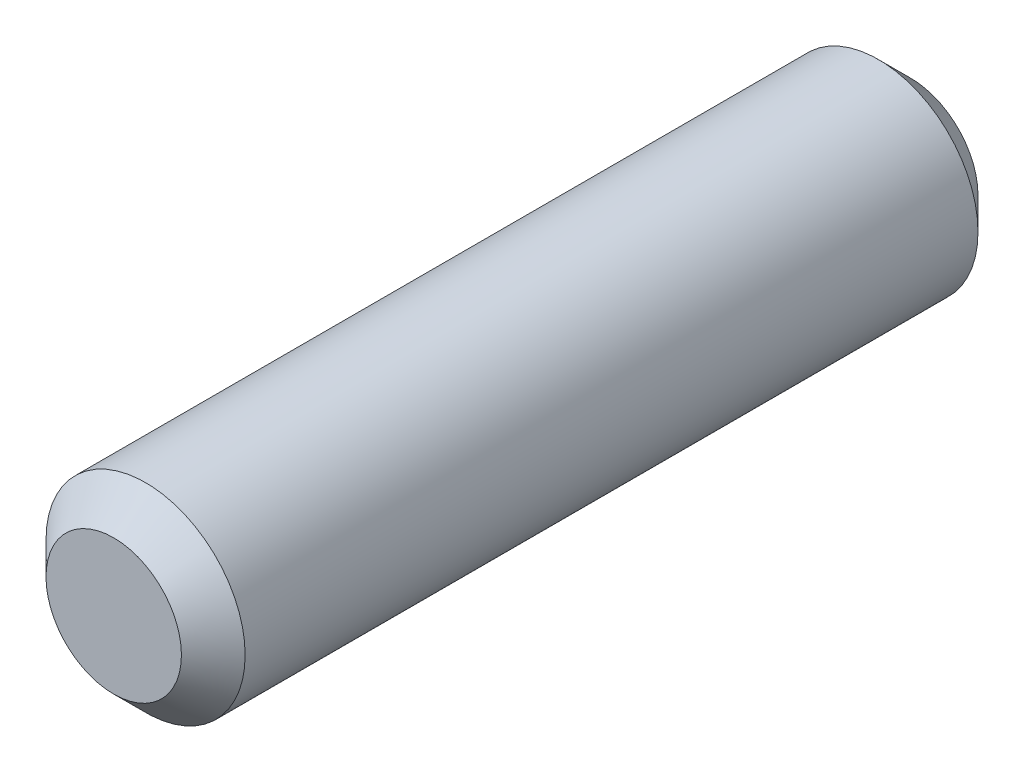
ISO-10303-21;
HEADER;
FILE_DESCRIPTION(('STEP AP214'),'2;1');
FILE_NAME('part.step','',(''),(''),'','','');
FILE_SCHEMA(('AUTOMOTIVE_DESIGN { 1 0 10303 214 1 1 1 1 }'));
ENDSEC;
DATA;
#1=APPLICATION_CONTEXT('core data for automotive mechanical design processes');
#2=APPLICATION_PROTOCOL_DEFINITION('international standard','automotive_design',2000,#1);
#3=PRODUCT_CONTEXT('',#1,'mechanical');
#4=PRODUCT('Part','Part','',(#3));
#5=PRODUCT_RELATED_PRODUCT_CATEGORY('part','',(#4));
#6=PRODUCT_DEFINITION_FORMATION('','',#4);
#7=PRODUCT_DEFINITION_CONTEXT('part definition',#1,'design');
#8=PRODUCT_DEFINITION('design','',#6,#7);
#9=PRODUCT_DEFINITION_SHAPE('','',#8);
#10=(LENGTH_UNIT() NAMED_UNIT(*) SI_UNIT(.MILLI.,.METRE.));
#11=(NAMED_UNIT(*) PLANE_ANGLE_UNIT() SI_UNIT($,.RADIAN.));
#12=(NAMED_UNIT(*) SI_UNIT($,.STERADIAN.) SOLID_ANGLE_UNIT());
#13=UNCERTAINTY_MEASURE_WITH_UNIT(LENGTH_MEASURE(1.E-05),#10,'distance_accuracy_value','');
#14=(GEOMETRIC_REPRESENTATION_CONTEXT(3) GLOBAL_UNCERTAINTY_ASSIGNED_CONTEXT((#13)) GLOBAL_UNIT_ASSIGNED_CONTEXT((#10,
#11,#12)) REPRESENTATION_CONTEXT('',''));
#15=CARTESIAN_POINT('',(0.,0.,0.));
#16=DIRECTION('',(0.,0.,1.));
#17=DIRECTION('',(1.,0.,0.));
#18=AXIS2_PLACEMENT_3D('',#15,#16,#17);
#19=CARTESIAN_POINT('',(0.,0.,4.7625));
#20=DIRECTION('',(0.,0.,-1.));
#21=DIRECTION('',(-1.,0.,0.));
#22=AXIS2_PLACEMENT_3D('',#19,#20,#21);
#23=CYLINDRICAL_SURFACE('',#22,1.190625);
#24=CARTESIAN_POINT('',(0.,0.,-4.38149999999999));
#25=DIRECTION('',(0.,0.,1.));
#26=DIRECTION('',(1.,0.,0.));
#27=AXIS2_PLACEMENT_3D('',#24,#25,#26);
#28=CIRCLE('',#27,1.190625);
#29=CARTESIAN_POINT('',(-1.190625,0.,-4.38149999999999));
#30=VERTEX_POINT('',#29);
#31=EDGE_CURVE('E41',#30,#30,#28,.T.);
#32=CARTESIAN_POINT('',(0.,0.,4.3815));
#33=DIRECTION('',(0.,0.,1.));
#34=DIRECTION('',(1.,0.,0.));
#35=AXIS2_PLACEMENT_3D('',#32,#33,#34);
#36=CIRCLE('',#35,1.190625);
#37=CARTESIAN_POINT('',(-1.190625,0.,4.3815));
#38=VERTEX_POINT('',#37);
#39=EDGE_CURVE('E45',#38,#38,#36,.F.);
#40=CARTESIAN_POINT('',(-1.190625,0.,-4.38149999999999));
#41=CARTESIAN_POINT('',(-1.190625,0.,-4.29021874999999));
#42=CARTESIAN_POINT('',(-1.190625,0.,-4.19893749999999));
#43=CARTESIAN_POINT('',(-1.190625,0.,-4.01637499999999));
#44=CARTESIAN_POINT('',(-1.190625,0.,-3.92509374999999));
#45=CARTESIAN_POINT('',(-1.190625,0.,-3.74253124999999));
#46=CARTESIAN_POINT('',(-1.190625,0.,-3.65124999999999));
#47=CARTESIAN_POINT('',(-1.190625,0.,-3.46868749999999));
#48=CARTESIAN_POINT('',(-1.190625,0.,-3.37740624999999));
#49=CARTESIAN_POINT('',(-1.190625,0.,-3.19484375));
#50=CARTESIAN_POINT('',(-1.190625,0.,-3.10356249999999));
#51=CARTESIAN_POINT('',(-1.190625,0.,-2.921));
#52=CARTESIAN_POINT('',(-1.190625,0.,-2.82971875));
#53=CARTESIAN_POINT('',(-1.190625,0.,-2.64715625));
#54=CARTESIAN_POINT('',(-1.190625,0.,-2.555875));
#55=CARTESIAN_POINT('',(-1.190625,0.,-2.3733125));
#56=CARTESIAN_POINT('',(-1.190625,0.,-2.28203124999999));
#57=CARTESIAN_POINT('',(-1.190625,0.,-2.09946874999999));
#58=CARTESIAN_POINT('',(-1.190625,0.,-2.0081875));
#59=CARTESIAN_POINT('',(-1.190625,0.,-1.825625));
#60=CARTESIAN_POINT('',(-1.190625,0.,-1.73434375));
#61=CARTESIAN_POINT('',(-1.190625,0.,-1.55178125));
#62=CARTESIAN_POINT('',(-1.190625,0.,-1.4605));
#63=CARTESIAN_POINT('',(-1.190625,0.,-1.2779375));
#64=CARTESIAN_POINT('',(-1.190625,0.,-1.18665625));
#65=CARTESIAN_POINT('',(-1.190625,0.,-1.00409375));
#66=CARTESIAN_POINT('',(-1.190625,0.,-0.912812499999995));
#67=CARTESIAN_POINT('',(-1.190625,0.,-0.730249999999995));
#68=CARTESIAN_POINT('',(-1.190625,0.,-0.638968749999996));
#69=CARTESIAN_POINT('',(-1.190625,0.,-0.456406249999996));
#70=CARTESIAN_POINT('',(-1.190625,0.,-0.365124999999996));
#71=CARTESIAN_POINT('',(-1.190625,0.,-0.182562499999995));
#72=CARTESIAN_POINT('',(-1.190625,0.,-0.0912812499999956));
#73=CARTESIAN_POINT('',(-1.190625,0.,0.0912812500000043));
#74=CARTESIAN_POINT('',(-1.190625,0.,0.182562500000004));
#75=CARTESIAN_POINT('',(-1.190625,0.,0.365125000000004));
#76=CARTESIAN_POINT('',(-1.190625,0.,0.456406250000004));
#77=CARTESIAN_POINT('',(-1.190625,0.,0.638968750000004));
#78=CARTESIAN_POINT('',(-1.190625,0.,0.730250000000004));
#79=CARTESIAN_POINT('',(-1.190625,0.,0.912812500000004));
#80=CARTESIAN_POINT('',(-1.190625,0.,1.00409375));
#81=CARTESIAN_POINT('',(-1.190625,0.,1.18665625));
#82=CARTESIAN_POINT('',(-1.190625,0.,1.2779375));
#83=CARTESIAN_POINT('',(-1.190625,0.,1.4605));
#84=CARTESIAN_POINT('',(-1.190625,0.,1.55178125));
#85=CARTESIAN_POINT('',(-1.190625,0.,1.73434375));
#86=CARTESIAN_POINT('',(-1.190625,0.,1.825625));
#87=CARTESIAN_POINT('',(-1.190625,0.,2.0081875));
#88=CARTESIAN_POINT('',(-1.190625,0.,2.09946875));
#89=CARTESIAN_POINT('',(-1.190625,0.,2.28203125));
#90=CARTESIAN_POINT('',(-1.190625,0.,2.3733125));
#91=CARTESIAN_POINT('',(-1.190625,0.,2.555875));
#92=CARTESIAN_POINT('',(-1.190625,0.,2.64715625));
#93=CARTESIAN_POINT('',(-1.190625,0.,2.82971875));
#94=CARTESIAN_POINT('',(-1.190625,0.,2.921));
#95=CARTESIAN_POINT('',(-1.190625,0.,3.1035625));
#96=CARTESIAN_POINT('',(-1.190625,0.,3.19484375));
#97=CARTESIAN_POINT('',(-1.190625,0.,3.37740625));
#98=CARTESIAN_POINT('',(-1.190625,0.,3.4686875));
#99=CARTESIAN_POINT('',(-1.190625,0.,3.65125));
#100=CARTESIAN_POINT('',(-1.190625,0.,3.74253125));
#101=CARTESIAN_POINT('',(-1.190625,0.,3.92509375));
#102=CARTESIAN_POINT('',(-1.190625,0.,4.016375));
#103=CARTESIAN_POINT('',(-1.190625,0.,4.1989375));
#104=CARTESIAN_POINT('',(-1.190625,0.,4.29021875));
#105=CARTESIAN_POINT('',(-1.190625,0.,4.3815));
#106=B_SPLINE_CURVE_WITH_KNOTS('',3,(#40,#41,#42,#43,#44,#45,#46,#47,#48,#49,#50,#51,#52,#53,
#54,#55,#56,#57,#58,#59,#60,#61,#62,#63,#64,#65,#66,#67,#68,#69,#70,#71,#72,#73,#74,#75,#76,#77,
#78,#79,#80,#81,#82,#83,#84,#85,#86,#87,#88,#89,#90,#91,#92,#93,#94,#95,#96,#97,#98,#99,#100,
#101,#102,#103,#104,#105),.UNSPECIFIED.,.F.,.F.,(4,2,2,2,2,2,2,2,2,2,2,2,2,2,2,2,2,2,2,2,2,2,2,
2,2,2,2,2,2,2,2,2,4),(0.,0.273843750000001,0.5476875,0.82153125,1.095375,1.36921875,1.6430625,
1.91690625,2.19075,2.46459375,2.7384375,3.01228125,3.286125,3.55996875,3.8338125,4.10765625,
4.3815,4.65534375,4.9291875,5.20303125,5.476875,5.75071875,6.0245625,6.29840625,6.57225,
6.84609375,7.1199375,7.39378125,7.667625,7.94146875,8.2153125,8.48915625,8.763),.UNSPECIFIED.);
#107=EDGE_CURVE('BSEAM30',#30,#38,#106,.T.);
#108=ORIENTED_EDGE('',*,*,#31,.T.);
#109=ORIENTED_EDGE('',*,*,#39,.T.);
#110=ORIENTED_EDGE('',*,*,#107,.T.);
#111=ORIENTED_EDGE('',*,*,#107,.F.);
#112=EDGE_LOOP('',(#108,#110,#109,#111));
#113=FACE_BOUND('',#112,.T.);
#114=ADVANCED_FACE('F30',(#113),#23,.T.);
#115=CARTESIAN_POINT('',(0.,0.,4.7625));
#116=DIRECTION('',(0.,0.,1.));
#117=DIRECTION('',(1.,0.,0.));
#118=AXIS2_PLACEMENT_3D('',#115,#116,#117);
#119=PLANE('',#118);
#120=CARTESIAN_POINT('',(0.,0.,4.7625));
#121=DIRECTION('',(0.,0.,1.));
#122=DIRECTION('',(1.,0.,0.));
#123=AXIS2_PLACEMENT_3D('',#120,#121,#122);
#124=CIRCLE('',#123,0.809625000000003);
#125=CARTESIAN_POINT('',(0.809625000000003,0.,4.7625));
#126=VERTEX_POINT('',#125);
#127=EDGE_CURVE('E10',#126,#126,#124,.T.);
#128=ORIENTED_EDGE('',*,*,#127,.T.);
#129=EDGE_LOOP('',(#128));
#130=FACE_BOUND('',#129,.T.);
#131=ADVANCED_FACE('F61',(#130),#119,.T.);
#132=CARTESIAN_POINT('',(0.,0.,-4.7625));
#133=DIRECTION('',(0.,0.,1.));
#134=DIRECTION('',(1.,0.,0.));
#135=AXIS2_PLACEMENT_3D('',#132,#133,#134);
#136=PLANE('',#135);
#137=CARTESIAN_POINT('',(0.,0.,-4.7625));
#138=DIRECTION('',(0.,0.,1.));
#139=DIRECTION('',(1.,0.,0.));
#140=AXIS2_PLACEMENT_3D('',#137,#138,#139);
#141=CIRCLE('',#140,0.809624999999991);
#142=CARTESIAN_POINT('',(0.809624999999991,0.,-4.7625));
#143=VERTEX_POINT('',#142);
#144=EDGE_CURVE('E37',#143,#143,#141,.F.);
#145=ORIENTED_EDGE('',*,*,#144,.T.);
#146=EDGE_LOOP('',(#145));
#147=FACE_BOUND('',#146,.T.);
#148=ADVANCED_FACE('F58',(#147),#136,.F.);
#149=CARTESIAN_POINT('',(0.,0.,-4.38149999999999));
#150=DIRECTION('',(0.,0.,1.));
#151=DIRECTION('',(1.,0.,0.));
#152=AXIS2_PLACEMENT_3D('',#149,#150,#151);
#153=CONICAL_SURFACE('',#152,1.190625,0.78539816339745);
#154=ORIENTED_EDGE('',*,*,#144,.F.);
#155=EDGE_LOOP('',(#154));
#156=FACE_BOUND('',#155,.T.);
#157=ORIENTED_EDGE('',*,*,#31,.F.);
#158=EDGE_LOOP('',(#157));
#159=FACE_BOUND('',#158,.T.);
#160=ADVANCED_FACE('F54',(#156,#159),#153,.T.);
#161=CARTESIAN_POINT('',(0.,0.,4.7625));
#162=DIRECTION('',(0.,0.,-1.));
#163=DIRECTION('',(-1.,0.,0.));
#164=AXIS2_PLACEMENT_3D('',#161,#162,#163);
#165=CONICAL_SURFACE('',#164,0.809625000000003,0.785398163397448);
#166=ORIENTED_EDGE('',*,*,#39,.F.);
#167=EDGE_LOOP('',(#166));
#168=FACE_BOUND('',#167,.T.);
#169=ORIENTED_EDGE('',*,*,#127,.F.);
#170=EDGE_LOOP('',(#169));
#171=FACE_BOUND('',#170,.T.);
#172=ADVANCED_FACE('F32',(#168,#171),#165,.T.);
#173=CLOSED_SHELL('',(#114,#131,#148,#160,#172));
#174=MANIFOLD_SOLID_BREP('B2',#173);
#175=ADVANCED_BREP_SHAPE_REPRESENTATION('',(#18,#174),#14);
#176=SHAPE_DEFINITION_REPRESENTATION(#9,#175);
ENDSEC;
END-ISO-10303-21;
